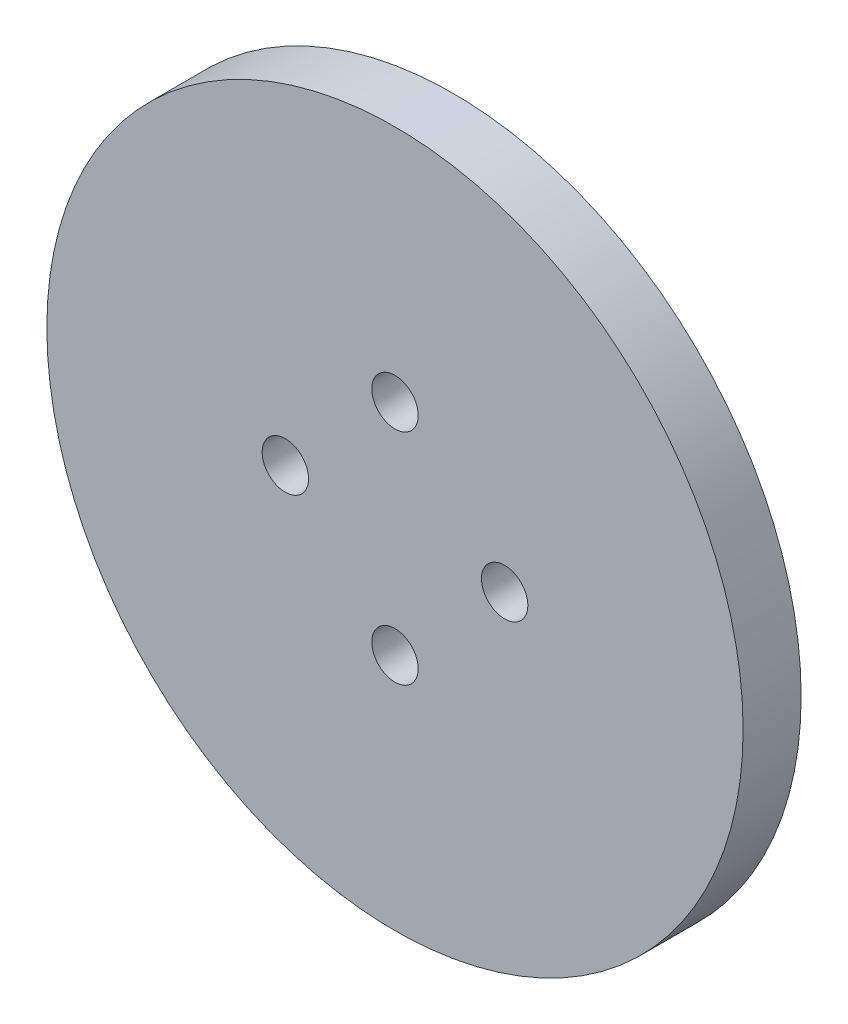
ISO-10303-21;
HEADER;
FILE_DESCRIPTION(('STEP AP214'),'2;1');
FILE_NAME('part.step','',(''),(''),'','','');
FILE_SCHEMA(('AUTOMOTIVE_DESIGN { 1 0 10303 214 1 1 1 1 }'));
ENDSEC;
DATA;
#1=APPLICATION_CONTEXT('core data for automotive mechanical design processes');
#2=APPLICATION_PROTOCOL_DEFINITION('international standard','automotive_design',2000,#1);
#3=PRODUCT_CONTEXT('',#1,'mechanical');
#4=PRODUCT('Part','Part','',(#3));
#5=PRODUCT_RELATED_PRODUCT_CATEGORY('part','',(#4));
#6=PRODUCT_DEFINITION_FORMATION('','',#4);
#7=PRODUCT_DEFINITION_CONTEXT('part definition',#1,'design');
#8=PRODUCT_DEFINITION('design','',#6,#7);
#9=PRODUCT_DEFINITION_SHAPE('','',#8);
#10=(LENGTH_UNIT() NAMED_UNIT(*) SI_UNIT(.MILLI.,.METRE.));
#11=(NAMED_UNIT(*) PLANE_ANGLE_UNIT() SI_UNIT($,.RADIAN.));
#12=(NAMED_UNIT(*) SI_UNIT($,.STERADIAN.) SOLID_ANGLE_UNIT());
#13=UNCERTAINTY_MEASURE_WITH_UNIT(LENGTH_MEASURE(1.E-05),#10,'distance_accuracy_value','');
#14=(GEOMETRIC_REPRESENTATION_CONTEXT(3) GLOBAL_UNCERTAINTY_ASSIGNED_CONTEXT((#13)) GLOBAL_UNIT_ASSIGNED_CONTEXT((#10,
#11,#12)) REPRESENTATION_CONTEXT('',''));
#15=CARTESIAN_POINT('',(0.,0.,0.));
#16=DIRECTION('',(0.,0.,1.));
#17=DIRECTION('',(1.,0.,0.));
#18=AXIS2_PLACEMENT_3D('',#15,#16,#17);
#19=CARTESIAN_POINT('',(0.,0.,6.35));
#20=DIRECTION('',(0.,0.,1.));
#21=DIRECTION('',(1.,0.,0.));
#22=AXIS2_PLACEMENT_3D('',#19,#20,#21);
#23=PLANE('',#22);
#24=CARTESIAN_POINT('',(-12.,0.,6.35));
#25=DIRECTION('',(0.,0.,1.));
#26=DIRECTION('',(1.,0.,0.));
#27=AXIS2_PLACEMENT_3D('',#24,#25,#26);
#28=CIRCLE('',#27,2.54000000000001);
#29=CARTESIAN_POINT('',(-9.45999999999999,0.,6.35));
#30=VERTEX_POINT('',#29);
#31=EDGE_CURVE('E68',#30,#30,#28,.T.);
#32=ORIENTED_EDGE('',*,*,#31,.F.);
#33=EDGE_LOOP('',(#32));
#34=FACE_BOUND('',#33,.T.);
#35=CARTESIAN_POINT('',(12.,0.,6.35));
#36=DIRECTION('',(0.,0.,1.));
#37=DIRECTION('',(1.,0.,0.));
#38=AXIS2_PLACEMENT_3D('',#35,#36,#37);
#39=CIRCLE('',#38,2.54000000000001);
#40=CARTESIAN_POINT('',(14.54,0.,6.35));
#41=VERTEX_POINT('',#40);
#42=EDGE_CURVE('E54',#41,#41,#39,.T.);
#43=ORIENTED_EDGE('',*,*,#42,.F.);
#44=EDGE_LOOP('',(#43));
#45=FACE_BOUND('',#44,.T.);
#46=CARTESIAN_POINT('',(0.,0.,6.35));
#47=DIRECTION('',(0.,0.,1.));
#48=DIRECTION('',(1.,0.,0.));
#49=AXIS2_PLACEMENT_3D('',#46,#47,#48);
#50=CIRCLE('',#49,38.1);
#51=CARTESIAN_POINT('',(38.1,0.,6.35));
#52=VERTEX_POINT('',#51);
#53=EDGE_CURVE('E10',#52,#52,#50,.T.);
#54=ORIENTED_EDGE('',*,*,#53,.T.);
#55=EDGE_LOOP('',(#54));
#56=FACE_BOUND('',#55,.T.);
#57=CARTESIAN_POINT('',(0.,-12.,6.35));
#58=DIRECTION('',(0.,0.,1.));
#59=DIRECTION('',(1.,0.,0.));
#60=AXIS2_PLACEMENT_3D('',#57,#58,#59);
#61=CIRCLE('',#60,2.54000000000001);
#62=CARTESIAN_POINT('',(2.54000000000001,-12.,6.35));
#63=VERTEX_POINT('',#62);
#64=EDGE_CURVE('E60',#63,#63,#61,.T.);
#65=ORIENTED_EDGE('',*,*,#64,.F.);
#66=EDGE_LOOP('',(#65));
#67=FACE_BOUND('',#66,.T.);
#68=CARTESIAN_POINT('',(0.,12.,6.35));
#69=DIRECTION('',(0.,0.,1.));
#70=DIRECTION('',(1.,0.,0.));
#71=AXIS2_PLACEMENT_3D('',#68,#69,#70);
#72=CIRCLE('',#71,2.54000000000001);
#73=CARTESIAN_POINT('',(2.54,12.,6.35));
#74=VERTEX_POINT('',#73);
#75=EDGE_CURVE('E76',#74,#74,#72,.T.);
#76=ORIENTED_EDGE('',*,*,#75,.F.);
#77=EDGE_LOOP('',(#76));
#78=FACE_BOUND('',#77,.T.);
#79=ADVANCED_FACE('F41',(#34,#45,#56,#67,#78),#23,.T.);
#80=CARTESIAN_POINT('',(0.,0.,0.));
#81=DIRECTION('',(0.,0.,1.));
#82=DIRECTION('',(1.,0.,0.));
#83=AXIS2_PLACEMENT_3D('',#80,#81,#82);
#84=PLANE('',#83);
#85=CARTESIAN_POINT('',(0.,0.,0.));
#86=DIRECTION('',(0.,0.,1.));
#87=DIRECTION('',(1.,0.,0.));
#88=AXIS2_PLACEMENT_3D('',#85,#86,#87);
#89=CIRCLE('',#88,38.1);
#90=CARTESIAN_POINT('',(38.1,0.,0.));
#91=VERTEX_POINT('',#90);
#92=EDGE_CURVE('E45',#91,#91,#89,.T.);
#93=ORIENTED_EDGE('',*,*,#92,.F.);
#94=EDGE_LOOP('',(#93));
#95=FACE_BOUND('',#94,.T.);
#96=CARTESIAN_POINT('',(12.,0.,0.));
#97=DIRECTION('',(0.,0.,1.));
#98=DIRECTION('',(1.,0.,0.));
#99=AXIS2_PLACEMENT_3D('',#96,#97,#98);
#100=CIRCLE('',#99,2.54000000000001);
#101=CARTESIAN_POINT('',(14.54,0.,0.));
#102=VERTEX_POINT('',#101);
#103=EDGE_CURVE('E56',#102,#102,#100,.T.);
#104=ORIENTED_EDGE('',*,*,#103,.T.);
#105=EDGE_LOOP('',(#104));
#106=FACE_BOUND('',#105,.T.);
#107=CARTESIAN_POINT('',(0.,-12.,0.));
#108=DIRECTION('',(0.,0.,1.));
#109=DIRECTION('',(1.,0.,0.));
#110=AXIS2_PLACEMENT_3D('',#107,#108,#109);
#111=CIRCLE('',#110,2.54000000000001);
#112=CARTESIAN_POINT('',(2.54000000000001,-12.,0.));
#113=VERTEX_POINT('',#112);
#114=EDGE_CURVE('E64',#113,#113,#111,.T.);
#115=ORIENTED_EDGE('',*,*,#114,.T.);
#116=EDGE_LOOP('',(#115));
#117=FACE_BOUND('',#116,.T.);
#118=CARTESIAN_POINT('',(-12.,0.,0.));
#119=DIRECTION('',(0.,0.,1.));
#120=DIRECTION('',(1.,0.,0.));
#121=AXIS2_PLACEMENT_3D('',#118,#119,#120);
#122=CIRCLE('',#121,2.54000000000001);
#123=CARTESIAN_POINT('',(-9.45999999999999,0.,0.));
#124=VERTEX_POINT('',#123);
#125=EDGE_CURVE('E72',#124,#124,#122,.T.);
#126=ORIENTED_EDGE('',*,*,#125,.T.);
#127=EDGE_LOOP('',(#126));
#128=FACE_BOUND('',#127,.T.);
#129=CARTESIAN_POINT('',(0.,12.,0.));
#130=DIRECTION('',(0.,0.,1.));
#131=DIRECTION('',(1.,0.,0.));
#132=AXIS2_PLACEMENT_3D('',#129,#130,#131);
#133=CIRCLE('',#132,2.54000000000001);
#134=CARTESIAN_POINT('',(2.54,12.,0.));
#135=VERTEX_POINT('',#134);
#136=EDGE_CURVE('E80',#135,#135,#133,.T.);
#137=ORIENTED_EDGE('',*,*,#136,.T.);
#138=EDGE_LOOP('',(#137));
#139=FACE_BOUND('',#138,.T.);
#140=ADVANCED_FACE('F92',(#95,#106,#117,#128,#139),#84,.F.);
#141=CARTESIAN_POINT('',(0.,0.,6.35));
#142=DIRECTION('',(0.,0.,-1.));
#143=DIRECTION('',(-1.,0.,0.));
#144=AXIS2_PLACEMENT_3D('',#141,#142,#143);
#145=CYLINDRICAL_SURFACE('',#144,38.1);
#146=ORIENTED_EDGE('',*,*,#53,.F.);
#147=EDGE_LOOP('',(#146));
#148=FACE_BOUND('',#147,.T.);
#149=ORIENTED_EDGE('',*,*,#92,.T.);
#150=EDGE_LOOP('',(#149));
#151=FACE_BOUND('',#150,.T.);
#152=ADVANCED_FACE('F43',(#148,#151),#145,.T.);
#153=CARTESIAN_POINT('',(12.,0.,6.35));
#154=DIRECTION('',(0.,0.,-1.));
#155=DIRECTION('',(-1.,0.,0.));
#156=AXIS2_PLACEMENT_3D('',#153,#154,#155);
#157=CYLINDRICAL_SURFACE('',#156,2.54000000000001);
#158=ORIENTED_EDGE('',*,*,#42,.T.);
#159=EDGE_LOOP('',(#158));
#160=FACE_BOUND('',#159,.T.);
#161=ORIENTED_EDGE('',*,*,#103,.F.);
#162=EDGE_LOOP('',(#161));
#163=FACE_BOUND('',#162,.T.);
#164=ADVANCED_FACE('F102',(#160,#163),#157,.F.);
#165=CARTESIAN_POINT('',(0.,-12.,6.35));
#166=DIRECTION('',(0.,0.,-1.));
#167=DIRECTION('',(-1.,0.,0.));
#168=AXIS2_PLACEMENT_3D('',#165,#166,#167);
#169=CYLINDRICAL_SURFACE('',#168,2.54000000000001);
#170=ORIENTED_EDGE('',*,*,#64,.T.);
#171=EDGE_LOOP('',(#170));
#172=FACE_BOUND('',#171,.T.);
#173=ORIENTED_EDGE('',*,*,#114,.F.);
#174=EDGE_LOOP('',(#173));
#175=FACE_BOUND('',#174,.T.);
#176=ADVANCED_FACE('F105',(#172,#175),#169,.F.);
#177=CARTESIAN_POINT('',(-12.,0.,6.35));
#178=DIRECTION('',(0.,0.,-1.));
#179=DIRECTION('',(-1.,0.,0.));
#180=AXIS2_PLACEMENT_3D('',#177,#178,#179);
#181=CYLINDRICAL_SURFACE('',#180,2.54000000000001);
#182=ORIENTED_EDGE('',*,*,#31,.T.);
#183=EDGE_LOOP('',(#182));
#184=FACE_BOUND('',#183,.T.);
#185=ORIENTED_EDGE('',*,*,#125,.F.);
#186=EDGE_LOOP('',(#185));
#187=FACE_BOUND('',#186,.T.);
#188=ADVANCED_FACE('F109',(#184,#187),#181,.F.);
#189=CARTESIAN_POINT('',(0.,12.,6.35));
#190=DIRECTION('',(0.,0.,-1.));
#191=DIRECTION('',(-1.,0.,0.));
#192=AXIS2_PLACEMENT_3D('',#189,#190,#191);
#193=CYLINDRICAL_SURFACE('',#192,2.54000000000001);
#194=ORIENTED_EDGE('',*,*,#75,.T.);
#195=EDGE_LOOP('',(#194));
#196=FACE_BOUND('',#195,.T.);
#197=ORIENTED_EDGE('',*,*,#136,.F.);
#198=EDGE_LOOP('',(#197));
#199=FACE_BOUND('',#198,.T.);
#200=ADVANCED_FACE('F88',(#196,#199),#193,.F.);
#201=CLOSED_SHELL('',(#79,#140,#152,#164,#176,#188,#200));
#202=MANIFOLD_SOLID_BREP('B2',#201);
#203=ADVANCED_BREP_SHAPE_REPRESENTATION('',(#18,#202),#14);
#204=SHAPE_DEFINITION_REPRESENTATION(#9,#203);
ENDSEC;
END-ISO-10303-21;
